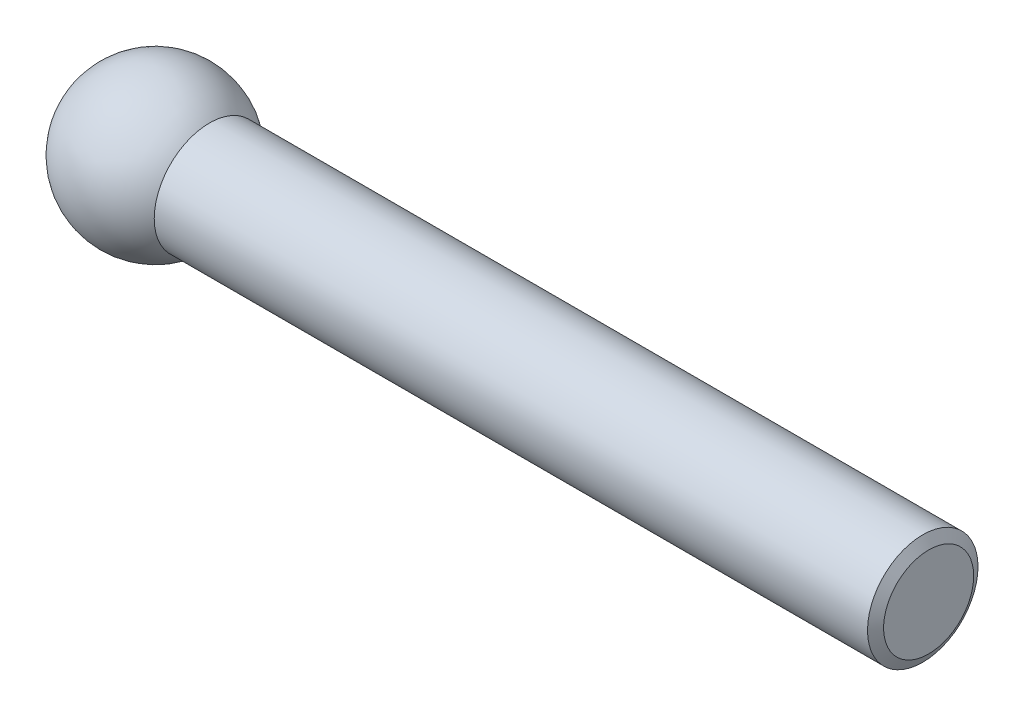
ISO-10303-21;
HEADER;
FILE_DESCRIPTION(('STEP AP214'),'2;1');
FILE_NAME('part.step','',(''),(''),'','','');
FILE_SCHEMA(('AUTOMOTIVE_DESIGN { 1 0 10303 214 1 1 1 1 }'));
ENDSEC;
DATA;
#1=APPLICATION_CONTEXT('core data for automotive mechanical design processes');
#2=APPLICATION_PROTOCOL_DEFINITION('international standard','automotive_design',2000,#1);
#3=PRODUCT_CONTEXT('',#1,'mechanical');
#4=PRODUCT('Part','Part','',(#3));
#5=PRODUCT_RELATED_PRODUCT_CATEGORY('part','',(#4));
#6=PRODUCT_DEFINITION_FORMATION('','',#4);
#7=PRODUCT_DEFINITION_CONTEXT('part definition',#1,'design');
#8=PRODUCT_DEFINITION('design','',#6,#7);
#9=PRODUCT_DEFINITION_SHAPE('','',#8);
#10=(LENGTH_UNIT() NAMED_UNIT(*) SI_UNIT(.MILLI.,.METRE.));
#11=(NAMED_UNIT(*) PLANE_ANGLE_UNIT() SI_UNIT($,.RADIAN.));
#12=(NAMED_UNIT(*) SI_UNIT($,.STERADIAN.) SOLID_ANGLE_UNIT());
#13=UNCERTAINTY_MEASURE_WITH_UNIT(LENGTH_MEASURE(1.E-05),#10,'distance_accuracy_value','');
#14=(GEOMETRIC_REPRESENTATION_CONTEXT(3) GLOBAL_UNCERTAINTY_ASSIGNED_CONTEXT((#13)) GLOBAL_UNIT_ASSIGNED_CONTEXT((#10,
#11,#12)) REPRESENTATION_CONTEXT('',''));
#15=CARTESIAN_POINT('',(0.,0.,0.));
#16=DIRECTION('',(0.,0.,1.));
#17=DIRECTION('',(1.,0.,0.));
#18=AXIS2_PLACEMENT_3D('',#15,#16,#17);
#19=CARTESIAN_POINT('',(200.,0.,0.));
#20=DIRECTION('',(-1.,0.,0.));
#21=DIRECTION('',(0.,0.,1.));
#22=AXIS2_PLACEMENT_3D('',#19,#20,#21);
#23=CYLINDRICAL_SURFACE('',#22,14.2875);
#24=CARTESIAN_POINT('',(198.476,0.,0.));
#25=DIRECTION('',(1.,0.,0.));
#26=DIRECTION('',(0.,0.,-1.));
#27=AXIS2_PLACEMENT_3D('',#24,#25,#26);
#28=CIRCLE('',#27,14.2875);
#29=CARTESIAN_POINT('',(198.476,0.,-14.2875));
#30=VERTEX_POINT('',#29);
#31=EDGE_CURVE('E43',#30,#30,#28,.F.);
#32=ORIENTED_EDGE('',*,*,#31,.T.);
#33=EDGE_LOOP('',(#32));
#34=FACE_BOUND('',#33,.T.);
#35=CARTESIAN_POINT('',(13.9952614748707,0.,0.));
#36=DIRECTION('',(-1.,0.,0.));
#37=DIRECTION('',(0.,0.,1.));
#38=AXIS2_PLACEMENT_3D('',#35,#36,#37);
#39=CIRCLE('',#38,14.2875);
#40=CARTESIAN_POINT('',(13.9952614748707,0.,14.2875));
#41=VERTEX_POINT('',#40);
#42=EDGE_CURVE('E10',#41,#41,#39,.T.);
#43=ORIENTED_EDGE('',*,*,#42,.F.);
#44=EDGE_LOOP('',(#43));
#45=FACE_BOUND('',#44,.T.);
#46=ADVANCED_FACE('F36',(#34,#45),#23,.T.);
#47=CARTESIAN_POINT('',(200.,0.,0.));
#48=DIRECTION('',(1.,0.,0.));
#49=DIRECTION('',(0.,0.,-1.));
#50=AXIS2_PLACEMENT_3D('',#47,#48,#49);
#51=PLANE('',#50);
#52=CARTESIAN_POINT('',(200.,0.,0.));
#53=DIRECTION('',(1.,0.,0.));
#54=DIRECTION('',(0.,0.,-1.));
#55=AXIS2_PLACEMENT_3D('',#52,#53,#54);
#56=CIRCLE('',#55,11.647854569265);
#57=CARTESIAN_POINT('',(200.,0.,-11.647854569265));
#58=VERTEX_POINT('',#57);
#59=EDGE_CURVE('E47',#58,#58,#56,.T.);
#60=ORIENTED_EDGE('',*,*,#59,.T.);
#61=EDGE_LOOP('',(#60));
#62=FACE_BOUND('',#61,.T.);
#63=ADVANCED_FACE('F54',(#62),#51,.T.);
#64=CARTESIAN_POINT('',(200.,0.,0.));
#65=DIRECTION('',(-1.,0.,0.));
#66=DIRECTION('',(0.,0.,1.));
#67=AXIS2_PLACEMENT_3D('',#64,#65,#66);
#68=CONICAL_SURFACE('',#67,11.647854569265,1.0471975511966);
#69=ORIENTED_EDGE('',*,*,#31,.F.);
#70=EDGE_LOOP('',(#69));
#71=FACE_BOUND('',#70,.T.);
#72=ORIENTED_EDGE('',*,*,#59,.F.);
#73=EDGE_LOOP('',(#72));
#74=FACE_BOUND('',#73,.T.);
#75=ADVANCED_FACE('F38',(#71,#74),#68,.T.);
#76=CARTESIAN_POINT('',(0.,0.,0.));
#77=DIRECTION('',(-1.,0.,0.));
#78=DIRECTION('',(0.,-1.,0.));
#79=AXIS2_PLACEMENT_3D('',#76,#77,#78);
#80=SPHERICAL_SURFACE('',#79,20.);
#81=ORIENTED_EDGE('',*,*,#42,.T.);
#82=EDGE_LOOP('',(#81));
#83=FACE_BOUND('',#82,.T.);
#84=ADVANCED_FACE('F57',(#83),#80,.T.);
#85=CLOSED_SHELL('',(#46,#63,#75,#84));
#86=MANIFOLD_SOLID_BREP('B2',#85);
#87=ADVANCED_BREP_SHAPE_REPRESENTATION('',(#18,#86),#14);
#88=SHAPE_DEFINITION_REPRESENTATION(#9,#87);
ENDSEC;
END-ISO-10303-21;
